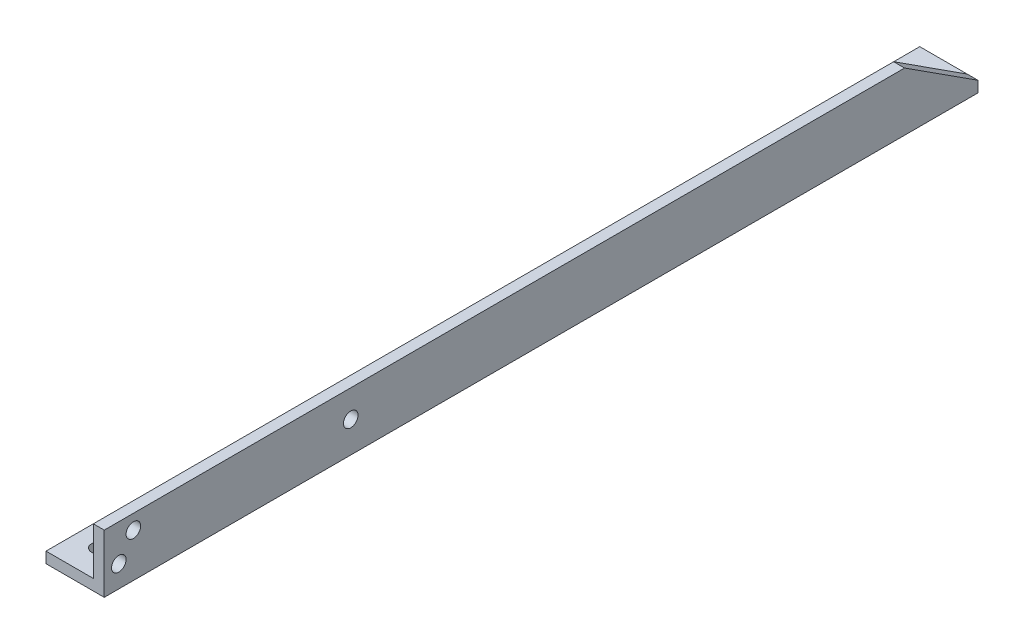
ISO-10303-21;
HEADER;
FILE_DESCRIPTION(('STEP AP214'),'2;1');
FILE_NAME('part.step','',(''),(''),'','','');
FILE_SCHEMA(('AUTOMOTIVE_DESIGN { 1 0 10303 214 1 1 1 1 }'));
ENDSEC;
DATA;
#1=APPLICATION_CONTEXT('core data for automotive mechanical design processes');
#2=APPLICATION_PROTOCOL_DEFINITION('international standard','automotive_design',2000,#1);
#3=PRODUCT_CONTEXT('',#1,'mechanical');
#4=PRODUCT('Part','Part','',(#3));
#5=PRODUCT_RELATED_PRODUCT_CATEGORY('part','',(#4));
#6=PRODUCT_DEFINITION_FORMATION('','',#4);
#7=PRODUCT_DEFINITION_CONTEXT('part definition',#1,'design');
#8=PRODUCT_DEFINITION('design','',#6,#7);
#9=PRODUCT_DEFINITION_SHAPE('','',#8);
#10=(LENGTH_UNIT() NAMED_UNIT(*) SI_UNIT(.MILLI.,.METRE.));
#11=(NAMED_UNIT(*) PLANE_ANGLE_UNIT() SI_UNIT($,.RADIAN.));
#12=(NAMED_UNIT(*) SI_UNIT($,.STERADIAN.) SOLID_ANGLE_UNIT());
#13=UNCERTAINTY_MEASURE_WITH_UNIT(LENGTH_MEASURE(1.E-05),#10,'distance_accuracy_value','');
#14=(GEOMETRIC_REPRESENTATION_CONTEXT(3) GLOBAL_UNCERTAINTY_ASSIGNED_CONTEXT((#13)) GLOBAL_UNIT_ASSIGNED_CONTEXT((#10,
#11,#12)) REPRESENTATION_CONTEXT('',''));
#15=CARTESIAN_POINT('',(0.,0.,0.));
#16=DIRECTION('',(0.,0.,1.));
#17=DIRECTION('',(1.,0.,0.));
#18=AXIS2_PLACEMENT_3D('',#15,#16,#17);
#19=CARTESIAN_POINT('',(-4.7625,0.,381.));
#20=DIRECTION('',(0.,-1.,0.));
#21=DIRECTION('',(0.,0.,-1.));
#22=AXIS2_PLACEMENT_3D('',#19,#20,#21);
#23=PLANE('',#22);
#24=DIRECTION('',(1.,0.,0.));
#25=VECTOR('',#24,1.);
#26=CARTESIAN_POINT('',(-483.12448375289,0.,32.0266075904083));
#27=LINE('',#26,#25);
#28=CARTESIAN_POINT('',(-4.76250000000011,0.,32.0266075904083));
#29=VERTEX_POINT('',#28);
#30=CARTESIAN_POINT('',(-1.11022302462516E-13,0.,32.0266075904083));
#31=VERTEX_POINT('',#30);
#32=EDGE_CURVE('E140',#29,#31,#27,.T.);
#33=ORIENTED_EDGE('',*,*,#32,.F.);
#34=DIRECTION('',(0.,0.,-1.));
#35=VECTOR('',#34,1.);
#36=CARTESIAN_POINT('',(-4.7625,0.,381.));
#37=LINE('',#36,#35);
#38=CARTESIAN_POINT('',(-4.7625,0.,381.));
#39=VERTEX_POINT('',#38);
#40=EDGE_CURVE('E40',#39,#29,#37,.T.);
#41=ORIENTED_EDGE('',*,*,#40,.F.);
#42=DIRECTION('',(-1.,0.,0.));
#43=VECTOR('',#42,1.);
#44=CARTESIAN_POINT('',(-4.7625,0.,381.));
#45=LINE('',#44,#43);
#46=CARTESIAN_POINT('',(0.,0.,381.));
#47=VERTEX_POINT('',#46);
#48=EDGE_CURVE('E124',#47,#39,#45,.T.);
#49=ORIENTED_EDGE('',*,*,#48,.F.);
#50=DIRECTION('',(0.,0.,-1.));
#51=VECTOR('',#50,1.);
#52=CARTESIAN_POINT('',(0.,0.,381.));
#53=LINE('',#52,#51);
#54=EDGE_CURVE('E112',#47,#31,#53,.T.);
#55=ORIENTED_EDGE('',*,*,#54,.T.);
#56=EDGE_LOOP('',(#33,#41,#49,#55));
#57=FACE_BOUND('',#56,.T.);
#58=ADVANCED_FACE('F33',(#57),#23,.F.);
#59=CARTESIAN_POINT('',(-4.7625,-20.6375,381.));
#60=DIRECTION('',(1.,0.,0.));
#61=DIRECTION('',(0.,1.,0.));
#62=AXIS2_PLACEMENT_3D('',#59,#60,#61);
#63=PLANE('',#62);
#64=CARTESIAN_POINT('',(-4.7625,-11.9296158183943,273.509298486636));
#65=DIRECTION('',(1.,0.,0.));
#66=DIRECTION('',(0.,1.,0.));
#67=AXIS2_PLACEMENT_3D('',#64,#65,#66);
#68=CIRCLE('',#67,3.17499999999997);
#69=CARTESIAN_POINT('',(-4.7625,-8.75461581839437,273.509298486636));
#70=VERTEX_POINT('',#69);
#71=EDGE_CURVE('E292',#70,#70,#68,.F.);
#72=ORIENTED_EDGE('',*,*,#71,.F.);
#73=EDGE_LOOP('',(#72));
#74=FACE_BOUND('',#73,.T.);
#75=CARTESIAN_POINT('',(-4.7625,-6.35,368.3));
#76=DIRECTION('',(-1.,0.,0.));
#77=DIRECTION('',(0.,-1.,0.));
#78=AXIS2_PLACEMENT_3D('',#75,#76,#77);
#79=CIRCLE('',#78,3.17499999999997);
#80=CARTESIAN_POINT('',(-4.7625,-9.52499999999997,368.3));
#81=VERTEX_POINT('',#80);
#82=EDGE_CURVE('E287',#81,#81,#79,.T.);
#83=ORIENTED_EDGE('',*,*,#82,.F.);
#84=EDGE_LOOP('',(#83));
#85=FACE_BOUND('',#84,.T.);
#86=CARTESIAN_POINT('',(-4.7625,-15.875,374.65));
#87=DIRECTION('',(-1.,0.,0.));
#88=DIRECTION('',(0.,-1.,0.));
#89=AXIS2_PLACEMENT_3D('',#86,#87,#88);
#90=CIRCLE('',#89,3.17499999999997);
#91=CARTESIAN_POINT('',(-4.7625,-19.05,374.65));
#92=VERTEX_POINT('',#91);
#93=EDGE_CURVE('E145',#92,#92,#90,.T.);
#94=ORIENTED_EDGE('',*,*,#93,.F.);
#95=EDGE_LOOP('',(#94));
#96=FACE_BOUND('',#95,.T.);
#97=DIRECTION('',(0.,0.541666666666667,0.840593375076334));
#98=VECTOR('',#97,1.);
#99=CARTESIAN_POINT('',(-4.76250000000001,152.839957781378,269.213541666667));
#100=LINE('',#99,#98);
#101=CARTESIAN_POINT('',(-4.76250000000011,-20.6375,0.));
#102=VERTEX_POINT('',#101);
#103=EDGE_CURVE('E118',#102,#29,#100,.T.);
#104=ORIENTED_EDGE('',*,*,#103,.F.);
#105=DIRECTION('',(0.,0.,-1.));
#106=VECTOR('',#105,1.);
#107=CARTESIAN_POINT('',(-4.7625,-20.6375,381.));
#108=LINE('',#107,#106);
#109=CARTESIAN_POINT('',(-4.7625,-20.6375,381.));
#110=VERTEX_POINT('',#109);
#111=EDGE_CURVE('E129',#110,#102,#108,.T.);
#112=ORIENTED_EDGE('',*,*,#111,.F.);
#113=DIRECTION('',(0.,-1.,0.));
#114=VECTOR('',#113,1.);
#115=CARTESIAN_POINT('',(-4.7625,-20.6375,381.));
#116=LINE('',#115,#114);
#117=EDGE_CURVE('E83',#39,#110,#116,.T.);
#118=ORIENTED_EDGE('',*,*,#117,.F.);
#119=ORIENTED_EDGE('',*,*,#40,.T.);
#120=EDGE_LOOP('',(#104,#112,#118,#119));
#121=FACE_BOUND('',#120,.T.);
#122=ADVANCED_FACE('F134',(#74,#85,#96,#121),#63,.F.);
#123=CARTESIAN_POINT('',(0.,0.,381.));
#124=DIRECTION('',(-1.,0.,0.));
#125=DIRECTION('',(0.,-1.,0.));
#126=AXIS2_PLACEMENT_3D('',#123,#124,#125);
#127=PLANE('',#126);
#128=CARTESIAN_POINT('',(0.,-11.9296158183943,273.509298486636));
#129=DIRECTION('',(1.,0.,0.));
#130=DIRECTION('',(0.,1.,0.));
#131=AXIS2_PLACEMENT_3D('',#128,#129,#130);
#132=CIRCLE('',#131,3.17499999999997);
#133=CARTESIAN_POINT('',(0.,-8.75461581839437,273.509298486636));
#134=VERTEX_POINT('',#133);
#135=EDGE_CURVE('E295',#134,#134,#132,.T.);
#136=ORIENTED_EDGE('',*,*,#135,.F.);
#137=EDGE_LOOP('',(#136));
#138=FACE_BOUND('',#137,.T.);
#139=CARTESIAN_POINT('',(0.,-6.35,368.3));
#140=DIRECTION('',(-1.,0.,0.));
#141=DIRECTION('',(0.,-1.,0.));
#142=AXIS2_PLACEMENT_3D('',#139,#140,#141);
#143=CIRCLE('',#142,3.17499999999997);
#144=CARTESIAN_POINT('',(0.,-9.52499999999997,368.3));
#145=VERTEX_POINT('',#144);
#146=EDGE_CURVE('E285',#145,#145,#143,.F.);
#147=ORIENTED_EDGE('',*,*,#146,.F.);
#148=EDGE_LOOP('',(#147));
#149=FACE_BOUND('',#148,.T.);
#150=CARTESIAN_POINT('',(0.,-15.875,374.65));
#151=DIRECTION('',(-1.,0.,0.));
#152=DIRECTION('',(0.,-1.,0.));
#153=AXIS2_PLACEMENT_3D('',#150,#151,#152);
#154=CIRCLE('',#153,3.17499999999997);
#155=CARTESIAN_POINT('',(0.,-19.05,374.65));
#156=VERTEX_POINT('',#155);
#157=EDGE_CURVE('E141',#156,#156,#154,.F.);
#158=ORIENTED_EDGE('',*,*,#157,.F.);
#159=EDGE_LOOP('',(#158));
#160=FACE_BOUND('',#159,.T.);
#161=DIRECTION('',(0.,-0.541666666666667,-0.840593375076334));
#162=VECTOR('',#161,1.);
#163=CARTESIAN_POINT('',(0.,158.895057607767,278.610237296491));
#164=LINE('',#163,#162);
#165=CARTESIAN_POINT('',(0.,-20.6375,0.));
#166=VERTEX_POINT('',#165);
#167=EDGE_CURVE('E47',#31,#166,#164,.T.);
#168=ORIENTED_EDGE('',*,*,#167,.F.);
#169=ORIENTED_EDGE('',*,*,#54,.F.);
#170=DIRECTION('',(0.,1.,0.));
#171=VECTOR('',#170,1.);
#172=CARTESIAN_POINT('',(0.,0.,381.));
#173=LINE('',#172,#171);
#174=CARTESIAN_POINT('',(0.,-25.4,381.));
#175=VERTEX_POINT('',#174);
#176=EDGE_CURVE('E55',#175,#47,#173,.T.);
#177=ORIENTED_EDGE('',*,*,#176,.F.);
#178=DIRECTION('',(0.,0.,-1.));
#179=VECTOR('',#178,1.);
#180=CARTESIAN_POINT('',(0.,-25.4,381.));
#181=LINE('',#180,#179);
#182=CARTESIAN_POINT('',(0.,-25.4,0.));
#183=VERTEX_POINT('',#182);
#184=EDGE_CURVE('E108',#175,#183,#181,.T.);
#185=ORIENTED_EDGE('',*,*,#184,.T.);
#186=DIRECTION('',(0.,1.,0.));
#187=VECTOR('',#186,1.);
#188=CARTESIAN_POINT('',(0.,0.,0.));
#189=LINE('',#188,#187);
#190=EDGE_CURVE('E121',#183,#166,#189,.T.);
#191=ORIENTED_EDGE('',*,*,#190,.T.);
#192=EDGE_LOOP('',(#168,#169,#177,#185,#191));
#193=FACE_BOUND('',#192,.T.);
#194=ADVANCED_FACE('F158',(#138,#149,#160,#193),#127,.F.);
#195=CARTESIAN_POINT('',(0.,0.,0.));
#196=DIRECTION('',(0.,0.,-1.));
#197=DIRECTION('',(-1.,0.,0.));
#198=AXIS2_PLACEMENT_3D('',#195,#196,#197);
#199=PLANE('',#198);
#200=DIRECTION('',(-1.,0.,0.));
#201=VECTOR('',#200,1.);
#202=CARTESIAN_POINT('',(-25.4,-20.6375,0.));
#203=LINE('',#202,#201);
#204=CARTESIAN_POINT('',(-25.4,-20.6375,0.));
#205=VERTEX_POINT('',#204);
#206=EDGE_CURVE('E116',#102,#205,#203,.T.);
#207=ORIENTED_EDGE('',*,*,#206,.F.);
#208=DIRECTION('',(1.,0.,0.));
#209=VECTOR('',#208,1.);
#210=CARTESIAN_POINT('',(0.,-20.6375,0.));
#211=LINE('',#210,#209);
#212=EDGE_CURVE('E11',#102,#166,#211,.T.);
#213=ORIENTED_EDGE('',*,*,#212,.T.);
#214=ORIENTED_EDGE('',*,*,#190,.F.);
#215=DIRECTION('',(1.,0.,0.));
#216=VECTOR('',#215,1.);
#217=CARTESIAN_POINT('',(0.,-25.4,0.));
#218=LINE('',#217,#216);
#219=CARTESIAN_POINT('',(-25.4,-25.4,0.));
#220=VERTEX_POINT('',#219);
#221=EDGE_CURVE('E74',#220,#183,#218,.T.);
#222=ORIENTED_EDGE('',*,*,#221,.F.);
#223=DIRECTION('',(0.,-1.,0.));
#224=VECTOR('',#223,1.);
#225=CARTESIAN_POINT('',(-25.4,-25.4,0.));
#226=LINE('',#225,#224);
#227=EDGE_CURVE('E106',#205,#220,#226,.T.);
#228=ORIENTED_EDGE('',*,*,#227,.F.);
#229=EDGE_LOOP('',(#207,#213,#214,#222,#228));
#230=FACE_BOUND('',#229,.T.);
#231=ADVANCED_FACE('F155',(#230),#199,.T.);
#232=CARTESIAN_POINT('',(-25.4,-20.6375,381.));
#233=DIRECTION('',(0.,-1.,0.));
#234=DIRECTION('',(0.,0.,-1.));
#235=AXIS2_PLACEMENT_3D('',#232,#233,#234);
#236=PLANE('',#235);
#237=CARTESIAN_POINT('',(-15.08125,-20.6375,368.3));
#238=DIRECTION('',(0.,1.,0.));
#239=DIRECTION('',(0.,0.,1.));
#240=AXIS2_PLACEMENT_3D('',#237,#238,#239);
#241=CIRCLE('',#240,3.175);
#242=CARTESIAN_POINT('',(-15.08125,-20.6375,371.475));
#243=VERTEX_POINT('',#242);
#244=EDGE_CURVE('E301',#243,#243,#241,.T.);
#245=ORIENTED_EDGE('',*,*,#244,.F.);
#246=EDGE_LOOP('',(#245));
#247=FACE_BOUND('',#246,.T.);
#248=ORIENTED_EDGE('',*,*,#206,.T.);
#249=DIRECTION('',(0.,0.,-1.));
#250=VECTOR('',#249,1.);
#251=CARTESIAN_POINT('',(-25.4,-20.6375,381.));
#252=LINE('',#251,#250);
#253=CARTESIAN_POINT('',(-25.4,-20.6375,381.));
#254=VERTEX_POINT('',#253);
#255=EDGE_CURVE('E107',#254,#205,#252,.T.);
#256=ORIENTED_EDGE('',*,*,#255,.F.);
#257=DIRECTION('',(-1.,0.,0.));
#258=VECTOR('',#257,1.);
#259=CARTESIAN_POINT('',(-25.4,-20.6375,381.));
#260=LINE('',#259,#258);
#261=EDGE_CURVE('E98',#110,#254,#260,.T.);
#262=ORIENTED_EDGE('',*,*,#261,.F.);
#263=ORIENTED_EDGE('',*,*,#111,.T.);
#264=EDGE_LOOP('',(#248,#256,#262,#263));
#265=FACE_BOUND('',#264,.T.);
#266=ADVANCED_FACE('F153',(#247,#265),#236,.F.);
#267=CARTESIAN_POINT('',(-25.4,-25.4,381.));
#268=DIRECTION('',(1.,0.,0.));
#269=DIRECTION('',(0.,1.,0.));
#270=AXIS2_PLACEMENT_3D('',#267,#268,#269);
#271=PLANE('',#270);
#272=ORIENTED_EDGE('',*,*,#227,.T.);
#273=DIRECTION('',(0.,0.,-1.));
#274=VECTOR('',#273,1.);
#275=CARTESIAN_POINT('',(-25.4,-25.4,381.));
#276=LINE('',#275,#274);
#277=CARTESIAN_POINT('',(-25.4,-25.4,381.));
#278=VERTEX_POINT('',#277);
#279=EDGE_CURVE('E103',#278,#220,#276,.T.);
#280=ORIENTED_EDGE('',*,*,#279,.F.);
#281=DIRECTION('',(0.,-1.,0.));
#282=VECTOR('',#281,1.);
#283=CARTESIAN_POINT('',(-25.4,-25.4,381.));
#284=LINE('',#283,#282);
#285=EDGE_CURVE('E92',#254,#278,#284,.T.);
#286=ORIENTED_EDGE('',*,*,#285,.F.);
#287=ORIENTED_EDGE('',*,*,#255,.T.);
#288=EDGE_LOOP('',(#272,#280,#286,#287));
#289=FACE_BOUND('',#288,.T.);
#290=ADVANCED_FACE('F104',(#289),#271,.F.);
#291=CARTESIAN_POINT('',(0.,-25.4,381.));
#292=DIRECTION('',(0.,1.,0.));
#293=DIRECTION('',(0.,0.,1.));
#294=AXIS2_PLACEMENT_3D('',#291,#292,#293);
#295=PLANE('',#294);
#296=CARTESIAN_POINT('',(-15.08125,-25.4,368.3));
#297=DIRECTION('',(0.,1.,0.));
#298=DIRECTION('',(0.,0.,1.));
#299=AXIS2_PLACEMENT_3D('',#296,#297,#298);
#300=CIRCLE('',#299,3.175);
#301=CARTESIAN_POINT('',(-15.08125,-25.4,371.475));
#302=VERTEX_POINT('',#301);
#303=EDGE_CURVE('E298',#302,#302,#300,.F.);
#304=ORIENTED_EDGE('',*,*,#303,.F.);
#305=EDGE_LOOP('',(#304));
#306=FACE_BOUND('',#305,.T.);
#307=ORIENTED_EDGE('',*,*,#221,.T.);
#308=ORIENTED_EDGE('',*,*,#184,.F.);
#309=DIRECTION('',(1.,0.,0.));
#310=VECTOR('',#309,1.);
#311=CARTESIAN_POINT('',(0.,-25.4,381.));
#312=LINE('',#311,#310);
#313=EDGE_CURVE('E96',#278,#175,#312,.T.);
#314=ORIENTED_EDGE('',*,*,#313,.F.);
#315=ORIENTED_EDGE('',*,*,#279,.T.);
#316=EDGE_LOOP('',(#307,#308,#314,#315));
#317=FACE_BOUND('',#316,.T.);
#318=ADVANCED_FACE('F110',(#306,#317),#295,.F.);
#319=CARTESIAN_POINT('',(0.,0.,381.));
#320=DIRECTION('',(0.,0.,-1.));
#321=DIRECTION('',(-1.,0.,0.));
#322=AXIS2_PLACEMENT_3D('',#319,#320,#321);
#323=PLANE('',#322);
#324=ORIENTED_EDGE('',*,*,#48,.T.);
#325=ORIENTED_EDGE('',*,*,#117,.T.);
#326=ORIENTED_EDGE('',*,*,#261,.T.);
#327=ORIENTED_EDGE('',*,*,#285,.T.);
#328=ORIENTED_EDGE('',*,*,#313,.T.);
#329=ORIENTED_EDGE('',*,*,#176,.T.);
#330=EDGE_LOOP('',(#324,#325,#326,#327,#328,#329));
#331=FACE_BOUND('',#330,.T.);
#332=ADVANCED_FACE('F94',(#331),#323,.F.);
#333=CARTESIAN_POINT('',(-483.12448375289,-20.6375,0.));
#334=DIRECTION('',(0.,0.840593375076334,-0.541666666666667));
#335=DIRECTION('',(0.,0.541666666666667,0.840593375076334));
#336=AXIS2_PLACEMENT_3D('',#333,#334,#335);
#337=PLANE('',#336);
#338=ORIENTED_EDGE('',*,*,#212,.F.);
#339=ORIENTED_EDGE('',*,*,#103,.T.);
#340=ORIENTED_EDGE('',*,*,#32,.T.);
#341=ORIENTED_EDGE('',*,*,#167,.T.);
#342=EDGE_LOOP('',(#338,#339,#340,#341));
#343=FACE_BOUND('',#342,.T.);
#344=ADVANCED_FACE('F244',(#343),#337,.T.);
#345=CARTESIAN_POINT('',(0.0010000000000036,-15.875,374.65));
#346=DIRECTION('',(-1.,0.,0.));
#347=DIRECTION('',(0.,-1.,0.));
#348=AXIS2_PLACEMENT_3D('',#345,#346,#347);
#349=CYLINDRICAL_SURFACE('',#348,3.17499999999997);
#350=ORIENTED_EDGE('',*,*,#93,.T.);
#351=EDGE_LOOP('',(#350));
#352=FACE_BOUND('',#351,.T.);
#353=ORIENTED_EDGE('',*,*,#157,.T.);
#354=EDGE_LOOP('',(#353));
#355=FACE_BOUND('',#354,.T.);
#356=ADVANCED_FACE('F240',(#352,#355),#349,.F.);
#357=CARTESIAN_POINT('',(0.00100000000000447,-6.35,368.3));
#358=DIRECTION('',(-1.,0.,0.));
#359=DIRECTION('',(0.,-1.,0.));
#360=AXIS2_PLACEMENT_3D('',#357,#358,#359);
#361=CYLINDRICAL_SURFACE('',#360,3.17499999999997);
#362=ORIENTED_EDGE('',*,*,#82,.T.);
#363=EDGE_LOOP('',(#362));
#364=FACE_BOUND('',#363,.T.);
#365=ORIENTED_EDGE('',*,*,#146,.T.);
#366=EDGE_LOOP('',(#365));
#367=FACE_BOUND('',#366,.T.);
#368=ADVANCED_FACE('F186',(#364,#367),#361,.F.);
#369=CARTESIAN_POINT('',(-25.401,-11.9296158183943,273.509298486636));
#370=DIRECTION('',(1.,0.,0.));
#371=DIRECTION('',(0.,1.,0.));
#372=AXIS2_PLACEMENT_3D('',#369,#370,#371);
#373=CYLINDRICAL_SURFACE('',#372,3.17499999999997);
#374=ORIENTED_EDGE('',*,*,#135,.T.);
#375=EDGE_LOOP('',(#374));
#376=FACE_BOUND('',#375,.T.);
#377=ORIENTED_EDGE('',*,*,#71,.T.);
#378=EDGE_LOOP('',(#377));
#379=FACE_BOUND('',#378,.T.);
#380=ADVANCED_FACE('F196',(#376,#379),#373,.F.);
#381=CARTESIAN_POINT('',(-15.08125,-25.401,368.3));
#382=DIRECTION('',(0.,1.,0.));
#383=DIRECTION('',(0.,0.,1.));
#384=AXIS2_PLACEMENT_3D('',#381,#382,#383);
#385=CYLINDRICAL_SURFACE('',#384,3.175);
#386=ORIENTED_EDGE('',*,*,#244,.T.);
#387=EDGE_LOOP('',(#386));
#388=FACE_BOUND('',#387,.T.);
#389=ORIENTED_EDGE('',*,*,#303,.T.);
#390=EDGE_LOOP('',(#389));
#391=FACE_BOUND('',#390,.T.);
#392=ADVANCED_FACE('F201',(#388,#391),#385,.F.);
#393=CLOSED_SHELL('',(#58,#122,#194,#231,#266,#290,#318,#332,#344,#356,#368,#380,#392));
#394=MANIFOLD_SOLID_BREP('B2',#393);
#395=ADVANCED_BREP_SHAPE_REPRESENTATION('',(#18,#394),#14);
#396=SHAPE_DEFINITION_REPRESENTATION(#9,#395);
ENDSEC;
END-ISO-10303-21;
